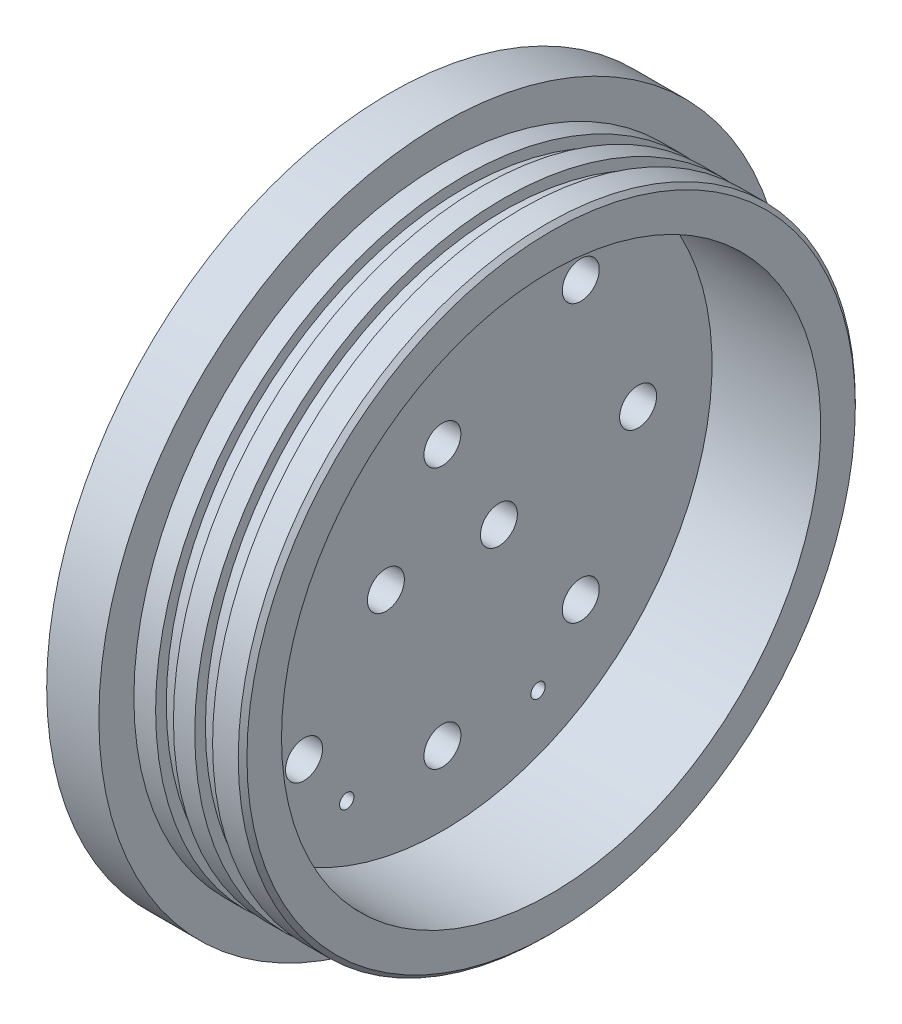
ISO-10303-21;
HEADER;
FILE_DESCRIPTION(('STEP AP214'),'2;1');
FILE_NAME('part.step','',(''),(''),'','','');
FILE_SCHEMA(('AUTOMOTIVE_DESIGN { 1 0 10303 214 1 1 1 1 }'));
ENDSEC;
DATA;
#1=APPLICATION_CONTEXT('core data for automotive mechanical design processes');
#2=APPLICATION_PROTOCOL_DEFINITION('international standard','automotive_design',2000,#1);
#3=PRODUCT_CONTEXT('',#1,'mechanical');
#4=PRODUCT('Part','Part','',(#3));
#5=PRODUCT_RELATED_PRODUCT_CATEGORY('part','',(#4));
#6=PRODUCT_DEFINITION_FORMATION('','',#4);
#7=PRODUCT_DEFINITION_CONTEXT('part definition',#1,'design');
#8=PRODUCT_DEFINITION('design','',#6,#7);
#9=PRODUCT_DEFINITION_SHAPE('','',#8);
#10=(LENGTH_UNIT() NAMED_UNIT(*) SI_UNIT(.MILLI.,.METRE.));
#11=(NAMED_UNIT(*) PLANE_ANGLE_UNIT() SI_UNIT($,.RADIAN.));
#12=(NAMED_UNIT(*) SI_UNIT($,.STERADIAN.) SOLID_ANGLE_UNIT());
#13=UNCERTAINTY_MEASURE_WITH_UNIT(LENGTH_MEASURE(1.E-05),#10,'distance_accuracy_value','');
#14=(GEOMETRIC_REPRESENTATION_CONTEXT(3) GLOBAL_UNCERTAINTY_ASSIGNED_CONTEXT((#13)) GLOBAL_UNIT_ASSIGNED_CONTEXT((#10,
#11,#12)) REPRESENTATION_CONTEXT('',''));
#15=CARTESIAN_POINT('',(0.,0.,0.));
#16=DIRECTION('',(0.,0.,1.));
#17=DIRECTION('',(1.,0.,0.));
#18=AXIS2_PLACEMENT_3D('',#15,#16,#17);
#19=CARTESIAN_POINT('',(0.,62.,0.));
#20=DIRECTION('',(-1.,0.,0.));
#21=DIRECTION('',(0.,0.,1.));
#22=AXIS2_PLACEMENT_3D('',#19,#20,#21);
#23=PLANE('',#22);
#24=CARTESIAN_POINT('',(0.,-45.,22.));
#25=DIRECTION('',(1.,0.,0.));
#26=DIRECTION('',(0.,0.,-1.));
#27=AXIS2_PLACEMENT_3D('',#24,#25,#26);
#28=CIRCLE('',#27,1.64999999999999);
#29=CARTESIAN_POINT('',(0.,-45.,20.35));
#30=VERTEX_POINT('',#29);
#31=EDGE_CURVE('E74',#30,#30,#28,.T.);
#32=ORIENTED_EDGE('',*,*,#31,.F.);
#33=EDGE_LOOP('',(#32));
#34=FACE_BOUND('',#33,.T.);
#35=CARTESIAN_POINT('',(0.,-7.50000000000001,-12.9903810567666));
#36=DIRECTION('',(-1.,0.,0.));
#37=DIRECTION('',(0.,0.,1.));
#38=AXIS2_PLACEMENT_3D('',#35,#36,#37);
#39=CIRCLE('',#38,4.24999999999999);
#40=CARTESIAN_POINT('',(0.,-7.50000000000001,-8.74038105676659));
#41=VERTEX_POINT('',#40);
#42=EDGE_CURVE('E52',#41,#41,#39,.T.);
#43=ORIENTED_EDGE('',*,*,#42,.T.);
#44=EDGE_LOOP('',(#43));
#45=FACE_BOUND('',#44,.T.);
#46=CARTESIAN_POINT('',(0.,-7.5,12.9903810567666));
#47=DIRECTION('',(-1.,0.,0.));
#48=DIRECTION('',(0.,0.,1.));
#49=AXIS2_PLACEMENT_3D('',#46,#47,#48);
#50=CIRCLE('',#49,4.24999999999999);
#51=CARTESIAN_POINT('',(0.,-7.5,17.2403810567666));
#52=VERTEX_POINT('',#51);
#53=EDGE_CURVE('E91',#52,#52,#50,.T.);
#54=ORIENTED_EDGE('',*,*,#53,.T.);
#55=EDGE_LOOP('',(#54));
#56=FACE_BOUND('',#55,.T.);
#57=CARTESIAN_POINT('',(0.,15.,0.));
#58=DIRECTION('',(-1.,0.,0.));
#59=DIRECTION('',(0.,0.,1.));
#60=AXIS2_PLACEMENT_3D('',#57,#58,#59);
#61=CIRCLE('',#60,4.24999999999999);
#62=CARTESIAN_POINT('',(0.,15.,4.24999999999999));
#63=VERTEX_POINT('',#62);
#64=EDGE_CURVE('E95',#63,#63,#61,.T.);
#65=ORIENTED_EDGE('',*,*,#64,.T.);
#66=EDGE_LOOP('',(#65));
#67=FACE_BOUND('',#66,.T.);
#68=CARTESIAN_POINT('',(0.,31.8198051533946,-31.8198051533946));
#69=DIRECTION('',(-1.,0.,0.));
#70=DIRECTION('',(0.,0.,1.));
#71=AXIS2_PLACEMENT_3D('',#68,#69,#70);
#72=CIRCLE('',#71,4.24999999999999);
#73=CARTESIAN_POINT('',(0.,31.8198051533946,-27.5698051533947));
#74=VERTEX_POINT('',#73);
#75=EDGE_CURVE('E101',#74,#74,#72,.T.);
#76=ORIENTED_EDGE('',*,*,#75,.T.);
#77=EDGE_LOOP('',(#76));
#78=FACE_BOUND('',#77,.T.);
#79=CARTESIAN_POINT('',(0.,0.,-45.));
#80=DIRECTION('',(-1.,0.,0.));
#81=DIRECTION('',(0.,0.,1.));
#82=AXIS2_PLACEMENT_3D('',#79,#80,#81);
#83=CIRCLE('',#82,4.24999999999999);
#84=CARTESIAN_POINT('',(0.,0.,-40.75));
#85=VERTEX_POINT('',#84);
#86=EDGE_CURVE('E105',#85,#85,#83,.T.);
#87=ORIENTED_EDGE('',*,*,#86,.T.);
#88=EDGE_LOOP('',(#87));
#89=FACE_BOUND('',#88,.T.);
#90=CARTESIAN_POINT('',(0.,-31.8198051533946,-31.8198051533946));
#91=DIRECTION('',(-1.,0.,0.));
#92=DIRECTION('',(0.,0.,1.));
#93=AXIS2_PLACEMENT_3D('',#90,#91,#92);
#94=CIRCLE('',#93,4.24999999999999);
#95=CARTESIAN_POINT('',(0.,-31.8198051533946,-27.5698051533946));
#96=VERTEX_POINT('',#95);
#97=EDGE_CURVE('E109',#96,#96,#94,.T.);
#98=ORIENTED_EDGE('',*,*,#97,.T.);
#99=EDGE_LOOP('',(#98));
#100=FACE_BOUND('',#99,.T.);
#101=CARTESIAN_POINT('',(0.,-45.,0.));
#102=DIRECTION('',(-1.,0.,0.));
#103=DIRECTION('',(0.,0.,1.));
#104=AXIS2_PLACEMENT_3D('',#101,#102,#103);
#105=CIRCLE('',#104,4.24999999999999);
#106=CARTESIAN_POINT('',(0.,-45.,4.24999999999999));
#107=VERTEX_POINT('',#106);
#108=EDGE_CURVE('E113',#107,#107,#105,.T.);
#109=ORIENTED_EDGE('',*,*,#108,.T.);
#110=EDGE_LOOP('',(#109));
#111=FACE_BOUND('',#110,.T.);
#112=CARTESIAN_POINT('',(0.,-31.8198051533946,31.8198051533946));
#113=DIRECTION('',(-1.,0.,0.));
#114=DIRECTION('',(0.,0.,1.));
#115=AXIS2_PLACEMENT_3D('',#112,#113,#114);
#116=CIRCLE('',#115,4.24999999999999);
#117=CARTESIAN_POINT('',(0.,-31.8198051533946,36.0698051533946));
#118=VERTEX_POINT('',#117);
#119=EDGE_CURVE('E117',#118,#118,#116,.T.);
#120=ORIENTED_EDGE('',*,*,#119,.T.);
#121=EDGE_LOOP('',(#120));
#122=FACE_BOUND('',#121,.T.);
#123=CARTESIAN_POINT('',(0.,0.,45.));
#124=DIRECTION('',(-1.,0.,0.));
#125=DIRECTION('',(0.,0.,1.));
#126=AXIS2_PLACEMENT_3D('',#123,#124,#125);
#127=CIRCLE('',#126,4.24999999999999);
#128=CARTESIAN_POINT('',(0.,0.,49.25));
#129=VERTEX_POINT('',#128);
#130=EDGE_CURVE('E121',#129,#129,#127,.T.);
#131=ORIENTED_EDGE('',*,*,#130,.T.);
#132=EDGE_LOOP('',(#131));
#133=FACE_BOUND('',#132,.T.);
#134=CARTESIAN_POINT('',(0.,31.8198051533946,31.8198051533946));
#135=DIRECTION('',(-1.,0.,0.));
#136=DIRECTION('',(0.,0.,1.));
#137=AXIS2_PLACEMENT_3D('',#134,#135,#136);
#138=CIRCLE('',#137,4.24999999999999);
#139=CARTESIAN_POINT('',(0.,31.8198051533946,36.0698051533946));
#140=VERTEX_POINT('',#139);
#141=EDGE_CURVE('E125',#140,#140,#138,.T.);
#142=ORIENTED_EDGE('',*,*,#141,.T.);
#143=EDGE_LOOP('',(#142));
#144=FACE_BOUND('',#143,.T.);
#145=CARTESIAN_POINT('',(0.,45.,0.));
#146=DIRECTION('',(-1.,0.,0.));
#147=DIRECTION('',(0.,0.,1.));
#148=AXIS2_PLACEMENT_3D('',#145,#146,#147);
#149=CIRCLE('',#148,4.24999999999999);
#150=CARTESIAN_POINT('',(0.,45.,4.24999999999999));
#151=VERTEX_POINT('',#150);
#152=EDGE_CURVE('E129',#151,#151,#149,.T.);
#153=ORIENTED_EDGE('',*,*,#152,.T.);
#154=EDGE_LOOP('',(#153));
#155=FACE_BOUND('',#154,.T.);
#156=CARTESIAN_POINT('',(0.,0.,0.));
#157=DIRECTION('',(-1.,0.,0.));
#158=DIRECTION('',(0.,0.,1.));
#159=AXIS2_PLACEMENT_3D('',#156,#157,#158);
#160=CIRCLE('',#159,62.);
#161=CARTESIAN_POINT('',(0.,0.,62.));
#162=VERTEX_POINT('',#161);
#163=EDGE_CURVE('E156',#162,#162,#160,.T.);
#164=ORIENTED_EDGE('',*,*,#163,.F.);
#165=EDGE_LOOP('',(#164));
#166=FACE_BOUND('',#165,.T.);
#167=CARTESIAN_POINT('',(0.,-45.,-22.));
#168=DIRECTION('',(1.,0.,0.));
#169=DIRECTION('',(0.,0.,-1.));
#170=AXIS2_PLACEMENT_3D('',#167,#168,#169);
#171=CIRCLE('',#170,1.64999999999999);
#172=CARTESIAN_POINT('',(0.,-45.,-23.65));
#173=VERTEX_POINT('',#172);
#174=EDGE_CURVE('E75',#173,#173,#171,.T.);
#175=ORIENTED_EDGE('',*,*,#174,.F.);
#176=EDGE_LOOP('',(#175));
#177=FACE_BOUND('',#176,.T.);
#178=ADVANCED_FACE('F47',(#34,#45,#56,#67,#78,#89,#100,#111,#122,#133,#144,#155,#166,#177),#23,.F.);
#179=CARTESIAN_POINT('',(0.,0.,0.));
#180=DIRECTION('',(-1.,0.,0.));
#181=DIRECTION('',(0.,0.,1.));
#182=AXIS2_PLACEMENT_3D('',#179,#180,#181);
#183=CYLINDRICAL_SURFACE('',#182,70.95);
#184=CARTESIAN_POINT('',(9.1,0.,0.));
#185=DIRECTION('',(-1.,0.,0.));
#186=DIRECTION('',(0.,0.,1.));
#187=AXIS2_PLACEMENT_3D('',#184,#185,#186);
#188=CIRCLE('',#187,70.95);
#189=CARTESIAN_POINT('',(9.1,0.,70.95));
#190=VERTEX_POINT('',#189);
#191=EDGE_CURVE('E147',#190,#190,#188,.T.);
#192=ORIENTED_EDGE('',*,*,#191,.F.);
#193=EDGE_LOOP('',(#192));
#194=FACE_BOUND('',#193,.T.);
#195=CARTESIAN_POINT('',(14.,0.,0.));
#196=DIRECTION('',(-1.,0.,0.));
#197=DIRECTION('',(0.,0.,1.));
#198=AXIS2_PLACEMENT_3D('',#195,#196,#197);
#199=CIRCLE('',#198,70.95);
#200=CARTESIAN_POINT('',(14.,0.,70.95));
#201=VERTEX_POINT('',#200);
#202=EDGE_CURVE('E132',#201,#201,#199,.T.);
#203=ORIENTED_EDGE('',*,*,#202,.T.);
#204=EDGE_LOOP('',(#203));
#205=FACE_BOUND('',#204,.T.);
#206=ADVANCED_FACE('F208',(#194,#205),#183,.T.);
#207=CARTESIAN_POINT('',(5.,70.95,0.));
#208=DIRECTION('',(1.,0.,0.));
#209=DIRECTION('',(0.,0.,-1.));
#210=AXIS2_PLACEMENT_3D('',#207,#208,#209);
#211=PLANE('',#210);
#212=CARTESIAN_POINT('',(5.,0.,0.));
#213=DIRECTION('',(-1.,0.,0.));
#214=DIRECTION('',(0.,0.,1.));
#215=AXIS2_PLACEMENT_3D('',#212,#213,#214);
#216=CIRCLE('',#215,68.5);
#217=CARTESIAN_POINT('',(5.,0.,68.5));
#218=VERTEX_POINT('',#217);
#219=EDGE_CURVE('E153',#218,#218,#216,.T.);
#220=ORIENTED_EDGE('',*,*,#219,.T.);
#221=EDGE_LOOP('',(#220));
#222=FACE_BOUND('',#221,.T.);
#223=CARTESIAN_POINT('',(5.,0.,0.));
#224=DIRECTION('',(-1.,0.,0.));
#225=DIRECTION('',(0.,0.,1.));
#226=AXIS2_PLACEMENT_3D('',#223,#224,#225);
#227=CIRCLE('',#226,70.95);
#228=CARTESIAN_POINT('',(5.,0.,70.95));
#229=VERTEX_POINT('',#228);
#230=EDGE_CURVE('E144',#229,#229,#227,.T.);
#231=ORIENTED_EDGE('',*,*,#230,.F.);
#232=EDGE_LOOP('',(#231));
#233=FACE_BOUND('',#232,.T.);
#234=ADVANCED_FACE('F215',(#222,#233),#211,.T.);
#235=CARTESIAN_POINT('',(0.,0.,0.));
#236=DIRECTION('',(-1.,0.,0.));
#237=DIRECTION('',(0.,0.,1.));
#238=AXIS2_PLACEMENT_3D('',#235,#236,#237);
#239=CYLINDRICAL_SURFACE('',#238,68.5);
#240=CARTESIAN_POINT('',(9.1,0.,0.));
#241=DIRECTION('',(-1.,0.,0.));
#242=DIRECTION('',(0.,0.,1.));
#243=AXIS2_PLACEMENT_3D('',#240,#241,#242);
#244=CIRCLE('',#243,68.5);
#245=CARTESIAN_POINT('',(9.1,0.,68.5));
#246=VERTEX_POINT('',#245);
#247=EDGE_CURVE('E150',#246,#246,#244,.T.);
#248=ORIENTED_EDGE('',*,*,#247,.T.);
#249=EDGE_LOOP('',(#248));
#250=FACE_BOUND('',#249,.T.);
#251=ORIENTED_EDGE('',*,*,#219,.F.);
#252=EDGE_LOOP('',(#251));
#253=FACE_BOUND('',#252,.T.);
#254=ADVANCED_FACE('F253',(#250,#253),#239,.T.);
#255=CARTESIAN_POINT('',(9.1,68.5,0.));
#256=DIRECTION('',(-1.,0.,0.));
#257=DIRECTION('',(0.,0.,1.));
#258=AXIS2_PLACEMENT_3D('',#255,#256,#257);
#259=PLANE('',#258);
#260=ORIENTED_EDGE('',*,*,#191,.T.);
#261=EDGE_LOOP('',(#260));
#262=FACE_BOUND('',#261,.T.);
#263=ORIENTED_EDGE('',*,*,#247,.F.);
#264=EDGE_LOOP('',(#263));
#265=FACE_BOUND('',#264,.T.);
#266=ADVANCED_FACE('F246',(#262,#265),#259,.T.);
#267=CARTESIAN_POINT('',(-12.,0.,0.));
#268=DIRECTION('',(1.,0.,0.));
#269=DIRECTION('',(0.,0.,-1.));
#270=AXIS2_PLACEMENT_3D('',#267,#268,#269);
#271=PLANE('',#270);
#272=CARTESIAN_POINT('',(-12.,-7.50000000000001,-12.9903810567666));
#273=DIRECTION('',(-1.,0.,0.));
#274=DIRECTION('',(0.,0.,1.));
#275=AXIS2_PLACEMENT_3D('',#272,#273,#274);
#276=CIRCLE('',#275,4.24999999999999);
#277=CARTESIAN_POINT('',(-12.,-7.50000000000001,-8.74038105676659));
#278=VERTEX_POINT('',#277);
#279=EDGE_CURVE('E85',#278,#278,#276,.T.);
#280=ORIENTED_EDGE('',*,*,#279,.F.);
#281=EDGE_LOOP('',(#280));
#282=FACE_BOUND('',#281,.T.);
#283=CARTESIAN_POINT('',(-12.,-7.5,12.9903810567666));
#284=DIRECTION('',(-1.,0.,0.));
#285=DIRECTION('',(0.,0.,1.));
#286=AXIS2_PLACEMENT_3D('',#283,#284,#285);
#287=CIRCLE('',#286,4.24999999999999);
#288=CARTESIAN_POINT('',(-12.,-7.5,17.2403810567666));
#289=VERTEX_POINT('',#288);
#290=EDGE_CURVE('E88',#289,#289,#287,.T.);
#291=ORIENTED_EDGE('',*,*,#290,.F.);
#292=EDGE_LOOP('',(#291));
#293=FACE_BOUND('',#292,.T.);
#294=CARTESIAN_POINT('',(-12.,15.,0.));
#295=DIRECTION('',(-1.,0.,0.));
#296=DIRECTION('',(0.,0.,1.));
#297=AXIS2_PLACEMENT_3D('',#294,#295,#296);
#298=CIRCLE('',#297,4.24999999999999);
#299=CARTESIAN_POINT('',(-12.,15.,4.24999999999999));
#300=VERTEX_POINT('',#299);
#301=EDGE_CURVE('E92',#300,#300,#298,.T.);
#302=ORIENTED_EDGE('',*,*,#301,.F.);
#303=EDGE_LOOP('',(#302));
#304=FACE_BOUND('',#303,.T.);
#305=CARTESIAN_POINT('',(-12.,31.8198051533946,-31.8198051533946));
#306=DIRECTION('',(-1.,0.,0.));
#307=DIRECTION('',(0.,0.,1.));
#308=AXIS2_PLACEMENT_3D('',#305,#306,#307);
#309=CIRCLE('',#308,4.24999999999999);
#310=CARTESIAN_POINT('',(-12.,31.8198051533946,-27.5698051533947));
#311=VERTEX_POINT('',#310);
#312=EDGE_CURVE('E98',#311,#311,#309,.T.);
#313=ORIENTED_EDGE('',*,*,#312,.F.);
#314=EDGE_LOOP('',(#313));
#315=FACE_BOUND('',#314,.T.);
#316=CARTESIAN_POINT('',(-12.,0.,-45.));
#317=DIRECTION('',(-1.,0.,0.));
#318=DIRECTION('',(0.,0.,1.));
#319=AXIS2_PLACEMENT_3D('',#316,#317,#318);
#320=CIRCLE('',#319,4.24999999999999);
#321=CARTESIAN_POINT('',(-12.,0.,-40.75));
#322=VERTEX_POINT('',#321);
#323=EDGE_CURVE('E102',#322,#322,#320,.T.);
#324=ORIENTED_EDGE('',*,*,#323,.F.);
#325=EDGE_LOOP('',(#324));
#326=FACE_BOUND('',#325,.T.);
#327=CARTESIAN_POINT('',(-12.,-31.8198051533946,-31.8198051533946));
#328=DIRECTION('',(-1.,0.,0.));
#329=DIRECTION('',(0.,0.,1.));
#330=AXIS2_PLACEMENT_3D('',#327,#328,#329);
#331=CIRCLE('',#330,4.24999999999999);
#332=CARTESIAN_POINT('',(-12.,-31.8198051533946,-27.5698051533946));
#333=VERTEX_POINT('',#332);
#334=EDGE_CURVE('E106',#333,#333,#331,.T.);
#335=ORIENTED_EDGE('',*,*,#334,.F.);
#336=EDGE_LOOP('',(#335));
#337=FACE_BOUND('',#336,.T.);
#338=CARTESIAN_POINT('',(-12.,-45.,0.));
#339=DIRECTION('',(-1.,0.,0.));
#340=DIRECTION('',(0.,0.,1.));
#341=AXIS2_PLACEMENT_3D('',#338,#339,#340);
#342=CIRCLE('',#341,4.24999999999999);
#343=CARTESIAN_POINT('',(-12.,-45.,4.24999999999999));
#344=VERTEX_POINT('',#343);
#345=EDGE_CURVE('E110',#344,#344,#342,.T.);
#346=ORIENTED_EDGE('',*,*,#345,.F.);
#347=EDGE_LOOP('',(#346));
#348=FACE_BOUND('',#347,.T.);
#349=CARTESIAN_POINT('',(-12.,-31.8198051533946,31.8198051533946));
#350=DIRECTION('',(-1.,0.,0.));
#351=DIRECTION('',(0.,0.,1.));
#352=AXIS2_PLACEMENT_3D('',#349,#350,#351);
#353=CIRCLE('',#352,4.24999999999999);
#354=CARTESIAN_POINT('',(-12.,-31.8198051533946,36.0698051533946));
#355=VERTEX_POINT('',#354);
#356=EDGE_CURVE('E114',#355,#355,#353,.T.);
#357=ORIENTED_EDGE('',*,*,#356,.F.);
#358=EDGE_LOOP('',(#357));
#359=FACE_BOUND('',#358,.T.);
#360=CARTESIAN_POINT('',(-12.,0.,45.));
#361=DIRECTION('',(-1.,0.,0.));
#362=DIRECTION('',(0.,0.,1.));
#363=AXIS2_PLACEMENT_3D('',#360,#361,#362);
#364=CIRCLE('',#363,4.24999999999999);
#365=CARTESIAN_POINT('',(-12.,0.,49.25));
#366=VERTEX_POINT('',#365);
#367=EDGE_CURVE('E118',#366,#366,#364,.T.);
#368=ORIENTED_EDGE('',*,*,#367,.F.);
#369=EDGE_LOOP('',(#368));
#370=FACE_BOUND('',#369,.T.);
#371=CARTESIAN_POINT('',(-12.,31.8198051533946,31.8198051533946));
#372=DIRECTION('',(-1.,0.,0.));
#373=DIRECTION('',(0.,0.,1.));
#374=AXIS2_PLACEMENT_3D('',#371,#372,#373);
#375=CIRCLE('',#374,4.24999999999999);
#376=CARTESIAN_POINT('',(-12.,31.8198051533946,36.0698051533946));
#377=VERTEX_POINT('',#376);
#378=EDGE_CURVE('E122',#377,#377,#375,.T.);
#379=ORIENTED_EDGE('',*,*,#378,.F.);
#380=EDGE_LOOP('',(#379));
#381=FACE_BOUND('',#380,.T.);
#382=CARTESIAN_POINT('',(-12.,45.,0.));
#383=DIRECTION('',(-1.,0.,0.));
#384=DIRECTION('',(0.,0.,1.));
#385=AXIS2_PLACEMENT_3D('',#382,#383,#384);
#386=CIRCLE('',#385,4.24999999999999);
#387=CARTESIAN_POINT('',(-12.,45.,4.24999999999999));
#388=VERTEX_POINT('',#387);
#389=EDGE_CURVE('E126',#388,#388,#386,.T.);
#390=ORIENTED_EDGE('',*,*,#389,.F.);
#391=EDGE_LOOP('',(#390));
#392=FACE_BOUND('',#391,.T.);
#393=CARTESIAN_POINT('',(-12.,0.,0.));
#394=DIRECTION('',(-1.,0.,0.));
#395=DIRECTION('',(0.,0.,1.));
#396=AXIS2_PLACEMENT_3D('',#393,#394,#395);
#397=CIRCLE('',#396,79.);
#398=CARTESIAN_POINT('',(-12.,0.,79.));
#399=VERTEX_POINT('',#398);
#400=EDGE_CURVE('E168',#399,#399,#397,.T.);
#401=ORIENTED_EDGE('',*,*,#400,.T.);
#402=EDGE_LOOP('',(#401));
#403=FACE_BOUND('',#402,.T.);
#404=ADVANCED_FACE('F243',(#282,#293,#304,#315,#326,#337,#348,#359,#370,#381,#392,#403),#271,.F.);
#405=CARTESIAN_POINT('',(0.,0.,0.));
#406=DIRECTION('',(-1.,0.,0.));
#407=DIRECTION('',(0.,0.,1.));
#408=AXIS2_PLACEMENT_3D('',#405,#406,#407);
#409=CYLINDRICAL_SURFACE('',#408,79.);
#410=ORIENTED_EDGE('',*,*,#400,.F.);
#411=EDGE_LOOP('',(#410));
#412=FACE_BOUND('',#411,.T.);
#413=CARTESIAN_POINT('',(0.,0.,0.));
#414=DIRECTION('',(-1.,0.,0.));
#415=DIRECTION('',(0.,0.,1.));
#416=AXIS2_PLACEMENT_3D('',#413,#414,#415);
#417=CIRCLE('',#416,79.);
#418=CARTESIAN_POINT('',(0.,0.,79.));
#419=VERTEX_POINT('',#418);
#420=EDGE_CURVE('E165',#419,#419,#417,.T.);
#421=ORIENTED_EDGE('',*,*,#420,.T.);
#422=EDGE_LOOP('',(#421));
#423=FACE_BOUND('',#422,.T.);
#424=ADVANCED_FACE('F240',(#412,#423),#409,.T.);
#425=CARTESIAN_POINT('',(0.,79.,0.));
#426=DIRECTION('',(-1.,0.,0.));
#427=DIRECTION('',(0.,0.,1.));
#428=AXIS2_PLACEMENT_3D('',#425,#426,#427);
#429=PLANE('',#428);
#430=ORIENTED_EDGE('',*,*,#420,.F.);
#431=EDGE_LOOP('',(#430));
#432=FACE_BOUND('',#431,.T.);
#433=CARTESIAN_POINT('',(0.,0.,0.));
#434=DIRECTION('',(-1.,0.,0.));
#435=DIRECTION('',(0.,0.,1.));
#436=AXIS2_PLACEMENT_3D('',#433,#434,#435);
#437=CIRCLE('',#436,70.95);
#438=CARTESIAN_POINT('',(0.,0.,70.95));
#439=VERTEX_POINT('',#438);
#440=EDGE_CURVE('E162',#439,#439,#437,.T.);
#441=ORIENTED_EDGE('',*,*,#440,.T.);
#442=EDGE_LOOP('',(#441));
#443=FACE_BOUND('',#442,.T.);
#444=ADVANCED_FACE('F236',(#432,#443),#429,.F.);
#445=ORIENTED_EDGE('',*,*,#440,.F.);
#446=EDGE_LOOP('',(#445));
#447=FACE_BOUND('',#446,.T.);
#448=ORIENTED_EDGE('',*,*,#230,.T.);
#449=EDGE_LOOP('',(#448));
#450=FACE_BOUND('',#449,.T.);
#451=ADVANCED_FACE('F219',(#447,#450),#183,.T.);
#452=CARTESIAN_POINT('',(14.,70.95,0.));
#453=DIRECTION('',(1.,0.,0.));
#454=DIRECTION('',(0.,0.,-1.));
#455=AXIS2_PLACEMENT_3D('',#452,#453,#454);
#456=PLANE('',#455);
#457=CARTESIAN_POINT('',(14.,0.,0.));
#458=DIRECTION('',(-1.,0.,0.));
#459=DIRECTION('',(0.,0.,1.));
#460=AXIS2_PLACEMENT_3D('',#457,#458,#459);
#461=CIRCLE('',#460,68.5);
#462=CARTESIAN_POINT('',(14.,0.,68.5));
#463=VERTEX_POINT('',#462);
#464=EDGE_CURVE('E141',#463,#463,#461,.T.);
#465=ORIENTED_EDGE('',*,*,#464,.T.);
#466=EDGE_LOOP('',(#465));
#467=FACE_BOUND('',#466,.T.);
#468=ORIENTED_EDGE('',*,*,#202,.F.);
#469=EDGE_LOOP('',(#468));
#470=FACE_BOUND('',#469,.T.);
#471=ADVANCED_FACE('F235',(#467,#470),#456,.T.);
#472=CARTESIAN_POINT('',(9.,0.,0.));
#473=DIRECTION('',(-1.,0.,0.));
#474=DIRECTION('',(0.,0.,1.));
#475=AXIS2_PLACEMENT_3D('',#472,#473,#474);
#476=CYLINDRICAL_SURFACE('',#475,68.5);
#477=CARTESIAN_POINT('',(18.1,0.,0.));
#478=DIRECTION('',(-1.,0.,0.));
#479=DIRECTION('',(0.,0.,1.));
#480=AXIS2_PLACEMENT_3D('',#477,#478,#479);
#481=CIRCLE('',#480,68.5);
#482=CARTESIAN_POINT('',(18.1,0.,68.5));
#483=VERTEX_POINT('',#482);
#484=EDGE_CURVE('E138',#483,#483,#481,.T.);
#485=ORIENTED_EDGE('',*,*,#484,.T.);
#486=EDGE_LOOP('',(#485));
#487=FACE_BOUND('',#486,.T.);
#488=ORIENTED_EDGE('',*,*,#464,.F.);
#489=EDGE_LOOP('',(#488));
#490=FACE_BOUND('',#489,.T.);
#491=ADVANCED_FACE('F300',(#487,#490),#476,.T.);
#492=CARTESIAN_POINT('',(18.1,68.5,0.));
#493=DIRECTION('',(-1.,0.,0.));
#494=DIRECTION('',(0.,0.,1.));
#495=AXIS2_PLACEMENT_3D('',#492,#493,#494);
#496=PLANE('',#495);
#497=CARTESIAN_POINT('',(18.1,0.,0.));
#498=DIRECTION('',(-1.,0.,0.));
#499=DIRECTION('',(0.,0.,1.));
#500=AXIS2_PLACEMENT_3D('',#497,#498,#499);
#501=CIRCLE('',#500,70.95);
#502=CARTESIAN_POINT('',(18.1,0.,70.95));
#503=VERTEX_POINT('',#502);
#504=EDGE_CURVE('E135',#503,#503,#501,.T.);
#505=ORIENTED_EDGE('',*,*,#504,.T.);
#506=EDGE_LOOP('',(#505));
#507=FACE_BOUND('',#506,.T.);
#508=ORIENTED_EDGE('',*,*,#484,.F.);
#509=EDGE_LOOP('',(#508));
#510=FACE_BOUND('',#509,.T.);
#511=ADVANCED_FACE('F229',(#507,#510),#496,.T.);
#512=CARTESIAN_POINT('',(0.,0.,0.));
#513=DIRECTION('',(-1.,0.,0.));
#514=DIRECTION('',(0.,0.,1.));
#515=AXIS2_PLACEMENT_3D('',#512,#513,#514);
#516=CYLINDRICAL_SURFACE('',#515,62.);
#517=CARTESIAN_POINT('',(25.,0.,0.));
#518=DIRECTION('',(-1.,0.,0.));
#519=DIRECTION('',(0.,0.,1.));
#520=AXIS2_PLACEMENT_3D('',#517,#518,#519);
#521=CIRCLE('',#520,62.);
#522=CARTESIAN_POINT('',(25.,0.,62.));
#523=VERTEX_POINT('',#522);
#524=EDGE_CURVE('E159',#523,#523,#521,.T.);
#525=ORIENTED_EDGE('',*,*,#524,.F.);
#526=EDGE_LOOP('',(#525));
#527=FACE_BOUND('',#526,.T.);
#528=ORIENTED_EDGE('',*,*,#163,.T.);
#529=EDGE_LOOP('',(#528));
#530=FACE_BOUND('',#529,.T.);
#531=ADVANCED_FACE('F225',(#527,#530),#516,.F.);
#532=CARTESIAN_POINT('',(25.,70.95,0.));
#533=DIRECTION('',(-1.,0.,0.));
#534=DIRECTION('',(0.,0.,1.));
#535=AXIS2_PLACEMENT_3D('',#532,#533,#534);
#536=PLANE('',#535);
#537=CARTESIAN_POINT('',(25.,0.,0.));
#538=DIRECTION('',(-1.,0.,0.));
#539=DIRECTION('',(0.,0.,1.));
#540=AXIS2_PLACEMENT_3D('',#537,#538,#539);
#541=CIRCLE('',#540,69.95);
#542=CARTESIAN_POINT('',(25.,0.,69.95));
#543=VERTEX_POINT('',#542);
#544=EDGE_CURVE('E11',#543,#543,#541,.F.);
#545=ORIENTED_EDGE('',*,*,#544,.T.);
#546=EDGE_LOOP('',(#545));
#547=FACE_BOUND('',#546,.T.);
#548=ORIENTED_EDGE('',*,*,#524,.T.);
#549=EDGE_LOOP('',(#548));
#550=FACE_BOUND('',#549,.T.);
#551=ADVANCED_FACE('F228',(#547,#550),#536,.F.);
#552=CARTESIAN_POINT('',(24.,0.,0.));
#553=DIRECTION('',(-1.,0.,0.));
#554=DIRECTION('',(0.,0.,1.));
#555=AXIS2_PLACEMENT_3D('',#552,#553,#554);
#556=CONICAL_SURFACE('',#555,70.95,0.785398163397455);
#557=ORIENTED_EDGE('',*,*,#544,.F.);
#558=EDGE_LOOP('',(#557));
#559=FACE_BOUND('',#558,.T.);
#560=CARTESIAN_POINT('',(24.,0.,0.));
#561=DIRECTION('',(-1.,0.,0.));
#562=DIRECTION('',(0.,0.,1.));
#563=AXIS2_PLACEMENT_3D('',#560,#561,#562);
#564=CIRCLE('',#563,70.95);
#565=CARTESIAN_POINT('',(24.,0.,70.95));
#566=VERTEX_POINT('',#565);
#567=EDGE_CURVE('E57',#566,#566,#564,.T.);
#568=ORIENTED_EDGE('',*,*,#567,.F.);
#569=EDGE_LOOP('',(#568));
#570=FACE_BOUND('',#569,.T.);
#571=ADVANCED_FACE('F50',(#559,#570),#556,.T.);
#572=ORIENTED_EDGE('',*,*,#567,.T.);
#573=EDGE_LOOP('',(#572));
#574=FACE_BOUND('',#573,.T.);
#575=ORIENTED_EDGE('',*,*,#504,.F.);
#576=EDGE_LOOP('',(#575));
#577=FACE_BOUND('',#576,.T.);
#578=ADVANCED_FACE('F218',(#574,#577),#183,.T.);
#579=CARTESIAN_POINT('',(-12.,45.,0.));
#580=DIRECTION('',(-1.,0.,0.));
#581=DIRECTION('',(0.,0.,1.));
#582=AXIS2_PLACEMENT_3D('',#579,#580,#581);
#583=CYLINDRICAL_SURFACE('',#582,4.24999999999999);
#584=ORIENTED_EDGE('',*,*,#389,.T.);
#585=EDGE_LOOP('',(#584));
#586=FACE_BOUND('',#585,.T.);
#587=ORIENTED_EDGE('',*,*,#152,.F.);
#588=EDGE_LOOP('',(#587));
#589=FACE_BOUND('',#588,.T.);
#590=ADVANCED_FACE('F308',(#586,#589),#583,.F.);
#591=CARTESIAN_POINT('',(-12.,31.8198051533946,31.8198051533946));
#592=DIRECTION('',(-1.,0.,0.));
#593=DIRECTION('',(0.,0.,1.));
#594=AXIS2_PLACEMENT_3D('',#591,#592,#593);
#595=CYLINDRICAL_SURFACE('',#594,4.24999999999999);
#596=ORIENTED_EDGE('',*,*,#378,.T.);
#597=EDGE_LOOP('',(#596));
#598=FACE_BOUND('',#597,.T.);
#599=ORIENTED_EDGE('',*,*,#141,.F.);
#600=EDGE_LOOP('',(#599));
#601=FACE_BOUND('',#600,.T.);
#602=ADVANCED_FACE('F311',(#598,#601),#595,.F.);
#603=CARTESIAN_POINT('',(-12.,0.,45.));
#604=DIRECTION('',(-1.,0.,0.));
#605=DIRECTION('',(0.,0.,1.));
#606=AXIS2_PLACEMENT_3D('',#603,#604,#605);
#607=CYLINDRICAL_SURFACE('',#606,4.24999999999999);
#608=ORIENTED_EDGE('',*,*,#367,.T.);
#609=EDGE_LOOP('',(#608));
#610=FACE_BOUND('',#609,.T.);
#611=ORIENTED_EDGE('',*,*,#130,.F.);
#612=EDGE_LOOP('',(#611));
#613=FACE_BOUND('',#612,.T.);
#614=ADVANCED_FACE('F315',(#610,#613),#607,.F.);
#615=CARTESIAN_POINT('',(-12.,-31.8198051533946,31.8198051533946));
#616=DIRECTION('',(-1.,0.,0.));
#617=DIRECTION('',(0.,0.,1.));
#618=AXIS2_PLACEMENT_3D('',#615,#616,#617);
#619=CYLINDRICAL_SURFACE('',#618,4.24999999999999);
#620=ORIENTED_EDGE('',*,*,#356,.T.);
#621=EDGE_LOOP('',(#620));
#622=FACE_BOUND('',#621,.T.);
#623=ORIENTED_EDGE('',*,*,#119,.F.);
#624=EDGE_LOOP('',(#623));
#625=FACE_BOUND('',#624,.T.);
#626=ADVANCED_FACE('F319',(#622,#625),#619,.F.);
#627=CARTESIAN_POINT('',(-12.,-45.,0.));
#628=DIRECTION('',(-1.,0.,0.));
#629=DIRECTION('',(0.,0.,1.));
#630=AXIS2_PLACEMENT_3D('',#627,#628,#629);
#631=CYLINDRICAL_SURFACE('',#630,4.24999999999999);
#632=ORIENTED_EDGE('',*,*,#345,.T.);
#633=EDGE_LOOP('',(#632));
#634=FACE_BOUND('',#633,.T.);
#635=ORIENTED_EDGE('',*,*,#108,.F.);
#636=EDGE_LOOP('',(#635));
#637=FACE_BOUND('',#636,.T.);
#638=ADVANCED_FACE('F323',(#634,#637),#631,.F.);
#639=CARTESIAN_POINT('',(-12.,-31.8198051533946,-31.8198051533946));
#640=DIRECTION('',(-1.,0.,0.));
#641=DIRECTION('',(0.,0.,1.));
#642=AXIS2_PLACEMENT_3D('',#639,#640,#641);
#643=CYLINDRICAL_SURFACE('',#642,4.24999999999999);
#644=ORIENTED_EDGE('',*,*,#334,.T.);
#645=EDGE_LOOP('',(#644));
#646=FACE_BOUND('',#645,.T.);
#647=ORIENTED_EDGE('',*,*,#97,.F.);
#648=EDGE_LOOP('',(#647));
#649=FACE_BOUND('',#648,.T.);
#650=ADVANCED_FACE('F327',(#646,#649),#643,.F.);
#651=CARTESIAN_POINT('',(-12.,0.,-45.));
#652=DIRECTION('',(-1.,0.,0.));
#653=DIRECTION('',(0.,0.,1.));
#654=AXIS2_PLACEMENT_3D('',#651,#652,#653);
#655=CYLINDRICAL_SURFACE('',#654,4.24999999999999);
#656=ORIENTED_EDGE('',*,*,#323,.T.);
#657=EDGE_LOOP('',(#656));
#658=FACE_BOUND('',#657,.T.);
#659=ORIENTED_EDGE('',*,*,#86,.F.);
#660=EDGE_LOOP('',(#659));
#661=FACE_BOUND('',#660,.T.);
#662=ADVANCED_FACE('F331',(#658,#661),#655,.F.);
#663=CARTESIAN_POINT('',(-12.,31.8198051533946,-31.8198051533946));
#664=DIRECTION('',(-1.,0.,0.));
#665=DIRECTION('',(0.,0.,1.));
#666=AXIS2_PLACEMENT_3D('',#663,#664,#665);
#667=CYLINDRICAL_SURFACE('',#666,4.24999999999999);
#668=ORIENTED_EDGE('',*,*,#312,.T.);
#669=EDGE_LOOP('',(#668));
#670=FACE_BOUND('',#669,.T.);
#671=ORIENTED_EDGE('',*,*,#75,.F.);
#672=EDGE_LOOP('',(#671));
#673=FACE_BOUND('',#672,.T.);
#674=ADVANCED_FACE('F204',(#670,#673),#667,.F.);
#675=CARTESIAN_POINT('',(-12.,15.,0.));
#676=DIRECTION('',(-1.,0.,0.));
#677=DIRECTION('',(0.,0.,1.));
#678=AXIS2_PLACEMENT_3D('',#675,#676,#677);
#679=CYLINDRICAL_SURFACE('',#678,4.24999999999999);
#680=ORIENTED_EDGE('',*,*,#301,.T.);
#681=EDGE_LOOP('',(#680));
#682=FACE_BOUND('',#681,.T.);
#683=ORIENTED_EDGE('',*,*,#64,.F.);
#684=EDGE_LOOP('',(#683));
#685=FACE_BOUND('',#684,.T.);
#686=ADVANCED_FACE('F194',(#682,#685),#679,.F.);
#687=CARTESIAN_POINT('',(-12.,-7.5,12.9903810567666));
#688=DIRECTION('',(-1.,0.,0.));
#689=DIRECTION('',(0.,0.,1.));
#690=AXIS2_PLACEMENT_3D('',#687,#688,#689);
#691=CYLINDRICAL_SURFACE('',#690,4.24999999999999);
#692=ORIENTED_EDGE('',*,*,#290,.T.);
#693=EDGE_LOOP('',(#692));
#694=FACE_BOUND('',#693,.T.);
#695=ORIENTED_EDGE('',*,*,#53,.F.);
#696=EDGE_LOOP('',(#695));
#697=FACE_BOUND('',#696,.T.);
#698=ADVANCED_FACE('F191',(#694,#697),#691,.F.);
#699=CARTESIAN_POINT('',(-12.,-7.50000000000001,-12.9903810567666));
#700=DIRECTION('',(-1.,0.,0.));
#701=DIRECTION('',(0.,0.,1.));
#702=AXIS2_PLACEMENT_3D('',#699,#700,#701);
#703=CYLINDRICAL_SURFACE('',#702,4.24999999999999);
#704=ORIENTED_EDGE('',*,*,#279,.T.);
#705=EDGE_LOOP('',(#704));
#706=FACE_BOUND('',#705,.T.);
#707=ORIENTED_EDGE('',*,*,#42,.F.);
#708=EDGE_LOOP('',(#707));
#709=FACE_BOUND('',#708,.T.);
#710=ADVANCED_FACE('F193',(#706,#709),#703,.F.);
#711=CARTESIAN_POINT('',(-7.99999999999999,-45.,22.));
#712=DIRECTION('',(1.,0.,0.));
#713=DIRECTION('',(0.,0.,-1.));
#714=AXIS2_PLACEMENT_3D('',#711,#712,#713);
#715=CONICAL_SURFACE('',#714,1.64999999999998,1.02974425867665);
#716=CARTESIAN_POINT('',(-8.99142002139548,-45.,22.));
#717=VERTEX_POINT('',#716);
#718=VERTEX_LOOP('',#717);
#719=FACE_BOUND('',#718,.T.);
#720=CARTESIAN_POINT('',(-7.99999999999999,-45.,22.));
#721=DIRECTION('',(1.,0.,0.));
#722=DIRECTION('',(0.,0.,-1.));
#723=AXIS2_PLACEMENT_3D('',#720,#721,#722);
#724=CIRCLE('',#723,1.64999999999998);
#725=CARTESIAN_POINT('',(-7.99999999999999,-45.,20.35));
#726=VERTEX_POINT('',#725);
#727=EDGE_CURVE('E78',#726,#726,#724,.T.);
#728=ORIENTED_EDGE('',*,*,#727,.T.);
#729=EDGE_LOOP('',(#728));
#730=FACE_BOUND('',#729,.T.);
#731=ADVANCED_FACE('F201',(#719,#730),#715,.F.);
#732=CARTESIAN_POINT('',(0.,-45.,22.));
#733=DIRECTION('',(1.,0.,0.));
#734=DIRECTION('',(0.,0.,-1.));
#735=AXIS2_PLACEMENT_3D('',#732,#733,#734);
#736=CYLINDRICAL_SURFACE('',#735,1.64999999999999);
#737=ORIENTED_EDGE('',*,*,#727,.F.);
#738=EDGE_LOOP('',(#737));
#739=FACE_BOUND('',#738,.T.);
#740=ORIENTED_EDGE('',*,*,#31,.T.);
#741=EDGE_LOOP('',(#740));
#742=FACE_BOUND('',#741,.T.);
#743=ADVANCED_FACE('F68',(#739,#742),#736,.F.);
#744=CARTESIAN_POINT('',(-7.99999999999999,-45.,-22.));
#745=DIRECTION('',(1.,0.,0.));
#746=DIRECTION('',(0.,0.,-1.));
#747=AXIS2_PLACEMENT_3D('',#744,#745,#746);
#748=CONICAL_SURFACE('',#747,1.64999999999998,1.02974425867665);
#749=CARTESIAN_POINT('',(-8.99142002139548,-45.,-22.));
#750=VERTEX_POINT('',#749);
#751=VERTEX_LOOP('',#750);
#752=FACE_BOUND('',#751,.T.);
#753=CARTESIAN_POINT('',(-7.99999999999999,-45.,-22.));
#754=DIRECTION('',(1.,0.,0.));
#755=DIRECTION('',(0.,0.,-1.));
#756=AXIS2_PLACEMENT_3D('',#753,#754,#755);
#757=CIRCLE('',#756,1.64999999999998);
#758=CARTESIAN_POINT('',(-7.99999999999999,-45.,-23.65));
#759=VERTEX_POINT('',#758);
#760=EDGE_CURVE('E72',#759,#759,#757,.T.);
#761=ORIENTED_EDGE('',*,*,#760,.T.);
#762=EDGE_LOOP('',(#761));
#763=FACE_BOUND('',#762,.T.);
#764=ADVANCED_FACE('F64',(#752,#763),#748,.F.);
#765=CARTESIAN_POINT('',(0.,-45.,-22.));
#766=DIRECTION('',(1.,0.,0.));
#767=DIRECTION('',(0.,0.,-1.));
#768=AXIS2_PLACEMENT_3D('',#765,#766,#767);
#769=CYLINDRICAL_SURFACE('',#768,1.64999999999999);
#770=ORIENTED_EDGE('',*,*,#760,.F.);
#771=EDGE_LOOP('',(#770));
#772=FACE_BOUND('',#771,.T.);
#773=ORIENTED_EDGE('',*,*,#174,.T.);
#774=EDGE_LOOP('',(#773));
#775=FACE_BOUND('',#774,.T.);
#776=ADVANCED_FACE('F67',(#772,#775),#769,.F.);
#777=CLOSED_SHELL('',(#178,#206,#234,#254,#266,#404,#424,#444,#451,#471,#491,#511,#531,#551,
#571,#578,#590,#602,#614,#626,#638,#650,#662,#674,#686,#698,#710,#731,#743,#764,#776));
#778=MANIFOLD_SOLID_BREP('B2',#777);
#779=ADVANCED_BREP_SHAPE_REPRESENTATION('',(#18,#778),#14);
#780=SHAPE_DEFINITION_REPRESENTATION(#9,#779);
ENDSEC;
END-ISO-10303-21;
